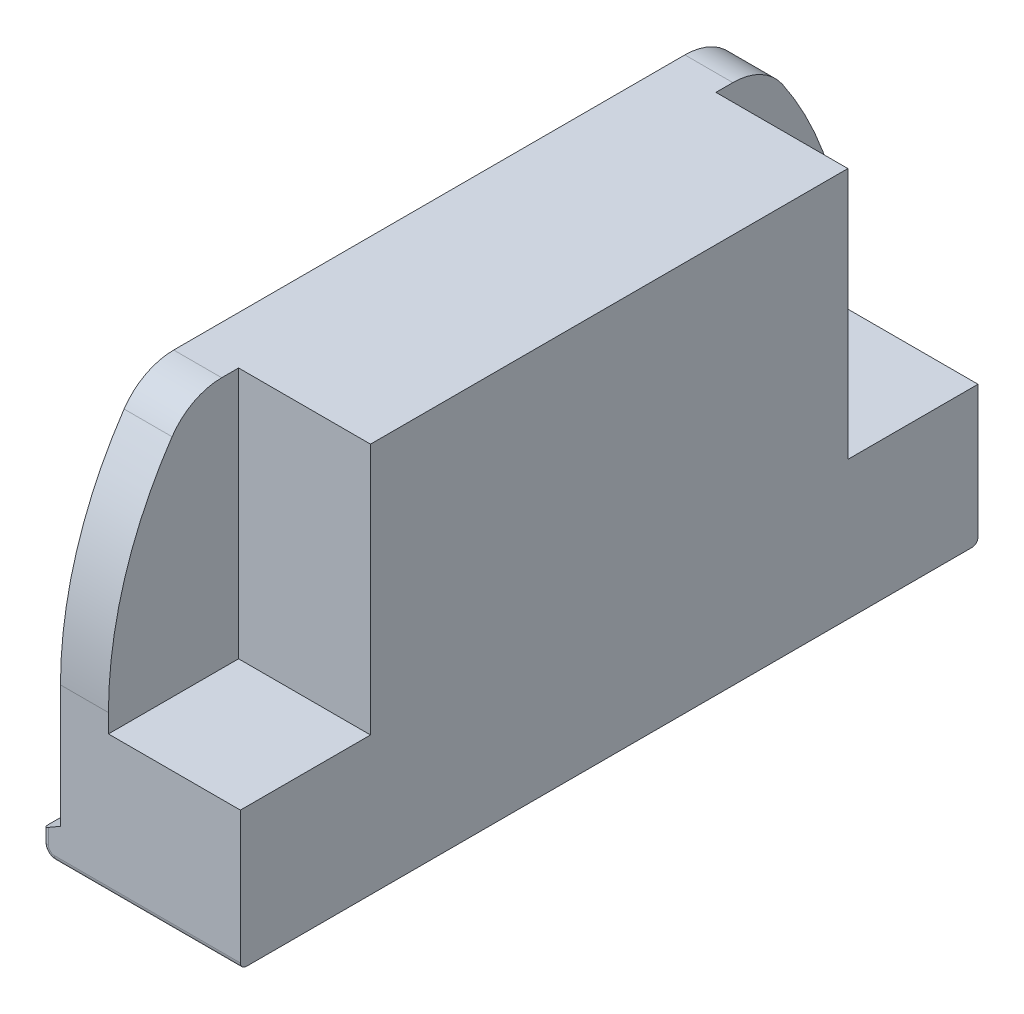
ISO-10303-21;
HEADER;
FILE_DESCRIPTION(('STEP AP214'),'2;1');
FILE_NAME('part.step','',(''),(''),'','','');
FILE_SCHEMA(('AUTOMOTIVE_DESIGN { 1 0 10303 214 1 1 1 1 }'));
ENDSEC;
DATA;
#1=APPLICATION_CONTEXT('core data for automotive mechanical design processes');
#2=APPLICATION_PROTOCOL_DEFINITION('international standard','automotive_design',2000,#1);
#3=PRODUCT_CONTEXT('',#1,'mechanical');
#4=PRODUCT('Part','Part','',(#3));
#5=PRODUCT_RELATED_PRODUCT_CATEGORY('part','',(#4));
#6=PRODUCT_DEFINITION_FORMATION('','',#4);
#7=PRODUCT_DEFINITION_CONTEXT('part definition',#1,'design');
#8=PRODUCT_DEFINITION('design','',#6,#7);
#9=PRODUCT_DEFINITION_SHAPE('','',#8);
#10=(LENGTH_UNIT() NAMED_UNIT(*) SI_UNIT(.MILLI.,.METRE.));
#11=(NAMED_UNIT(*) PLANE_ANGLE_UNIT() SI_UNIT($,.RADIAN.));
#12=(NAMED_UNIT(*) SI_UNIT($,.STERADIAN.) SOLID_ANGLE_UNIT());
#13=UNCERTAINTY_MEASURE_WITH_UNIT(LENGTH_MEASURE(1.E-05),#10,'distance_accuracy_value','');
#14=(GEOMETRIC_REPRESENTATION_CONTEXT(3) GLOBAL_UNCERTAINTY_ASSIGNED_CONTEXT((#13)) GLOBAL_UNIT_ASSIGNED_CONTEXT((#10,
#11,#12)) REPRESENTATION_CONTEXT('',''));
#15=CARTESIAN_POINT('',(0.,0.,0.));
#16=DIRECTION('',(0.,0.,1.));
#17=DIRECTION('',(1.,0.,0.));
#18=AXIS2_PLACEMENT_3D('',#15,#16,#17);
#19=CARTESIAN_POINT('',(0.299997713090983,1.78159871871872,12.3));
#20=DIRECTION('',(1.,0.,0.));
#21=DIRECTION('',(0.,0.,-1.));
#22=AXIS2_PLACEMENT_3D('',#19,#20,#21);
#23=PLANE('',#22);
#24=DIRECTION('',(0.,0.,-1.));
#25=VECTOR('',#24,1.);
#26=CARTESIAN_POINT('',(0.299997713090983,6.10745871871872,12.3));
#27=LINE('',#26,#25);
#28=CARTESIAN_POINT('',(0.299997713090983,6.10745872971482,10.4118765496414));
#29=VERTEX_POINT('',#28);
#30=CARTESIAN_POINT('',(0.299997713090983,6.10745872971482,1.88812345035856));
#31=VERTEX_POINT('',#30);
#32=EDGE_CURVE('E343',#29,#31,#27,.T.);
#33=ORIENTED_EDGE('',*,*,#32,.T.);
#34=CARTESIAN_POINT('',(0.299997713090983,5.10776748306749,1.88812345035856));
#35=DIRECTION('',(1.,0.,0.));
#36=DIRECTION('',(0.,0.,-1.));
#37=AXIS2_PLACEMENT_3D('',#34,#35,#36);
#38=CIRCLE('',#37,0.999691279635657);
#39=CARTESIAN_POINT('',(0.299997713090983,5.66904327195863,1.06086765957545));
#40=VERTEX_POINT('',#39);
#41=EDGE_CURVE('E245',#40,#31,#38,.T.);
#42=ORIENTED_EDGE('',*,*,#41,.F.);
#43=CARTESIAN_POINT('',(0.299997713090983,2.21592966698313,6.15035892658956));
#44=DIRECTION('',(1.,0.,0.));
#45=DIRECTION('',(0.,0.,-1.));
#46=AXIS2_PLACEMENT_3D('',#43,#44,#45);
#47=CIRCLE('',#46,6.15035892658956);
#48=CARTESIAN_POINT('',(0.299997713090983,2.21592966698313,0.));
#49=VERTEX_POINT('',#48);
#50=EDGE_CURVE('E252',#49,#40,#47,.T.);
#51=ORIENTED_EDGE('',*,*,#50,.F.);
#52=DIRECTION('',(0.,-1.,0.));
#53=VECTOR('',#52,1.);
#54=CARTESIAN_POINT('',(0.299997713090983,1.78159871871872,0.));
#55=LINE('',#54,#53);
#56=CARTESIAN_POINT('',(0.299997713090983,0.173208718718719,0.));
#57=VERTEX_POINT('',#56);
#58=EDGE_CURVE('E334',#49,#57,#55,.T.);
#59=ORIENTED_EDGE('',*,*,#58,.T.);
#60=DIRECTION('',(0.,0.,-1.));
#61=VECTOR('',#60,1.);
#62=CARTESIAN_POINT('',(0.299997713090983,0.173208718718719,12.3));
#63=LINE('',#62,#61);
#64=CARTESIAN_POINT('',(0.299997713090983,0.173208718718719,12.3));
#65=VERTEX_POINT('',#64);
#66=EDGE_CURVE('E340',#65,#57,#63,.T.);
#67=ORIENTED_EDGE('',*,*,#66,.F.);
#68=DIRECTION('',(0.,-1.,0.));
#69=VECTOR('',#68,1.);
#70=CARTESIAN_POINT('',(0.299997713090982,6.10745871871872,12.3));
#71=LINE('',#70,#69);
#72=CARTESIAN_POINT('',(0.299997713090983,2.21592966698313,12.3));
#73=VERTEX_POINT('',#72);
#74=EDGE_CURVE('E326',#73,#65,#71,.T.);
#75=ORIENTED_EDGE('',*,*,#74,.F.);
#76=CARTESIAN_POINT('',(0.299997713090983,2.21592966698313,6.14964107341044));
#77=DIRECTION('',(1.,0.,0.));
#78=DIRECTION('',(0.,0.,1.));
#79=AXIS2_PLACEMENT_3D('',#76,#77,#78);
#80=CIRCLE('',#79,6.15035892658956);
#81=CARTESIAN_POINT('',(0.299997713090983,5.66904327195863,11.2391323404246));
#82=VERTEX_POINT('',#81);
#83=EDGE_CURVE('E266',#82,#73,#80,.T.);
#84=ORIENTED_EDGE('',*,*,#83,.F.);
#85=CARTESIAN_POINT('',(0.299997713090983,5.10776748306749,10.4118765496414));
#86=DIRECTION('',(1.,0.,0.));
#87=DIRECTION('',(0.,0.,1.));
#88=AXIS2_PLACEMENT_3D('',#85,#86,#87);
#89=CIRCLE('',#88,0.999691279635658);
#90=EDGE_CURVE('E268',#29,#82,#89,.T.);
#91=ORIENTED_EDGE('',*,*,#90,.F.);
#92=EDGE_LOOP('',(#33,#42,#51,#59,#67,#75,#84,#91));
#93=FACE_BOUND('',#92,.T.);
#94=DIRECTION('',(0.,0.,1.));
#95=VECTOR('',#94,1.);
#96=CARTESIAN_POINT('',(0.299997713090983,4.37320871871872,3.00889598376581));
#97=LINE('',#96,#95);
#98=CARTESIAN_POINT('',(0.299997713090983,4.37320871871872,4.65));
#99=VERTEX_POINT('',#98);
#100=CARTESIAN_POINT('',(0.299997713090983,4.37320871871872,7.65));
#101=VERTEX_POINT('',#100);
#102=EDGE_CURVE('E220',#99,#101,#97,.T.);
#103=ORIENTED_EDGE('',*,*,#102,.T.);
#104=DIRECTION('',(0.,1.,0.));
#105=VECTOR('',#104,1.);
#106=CARTESIAN_POINT('',(0.299997713090983,2.78159871871872,7.65));
#107=LINE('',#106,#105);
#108=CARTESIAN_POINT('',(0.299997713090983,1.78159871871872,7.65));
#109=VERTEX_POINT('',#108);
#110=EDGE_CURVE('E203',#109,#101,#107,.T.);
#111=ORIENTED_EDGE('',*,*,#110,.F.);
#112=DIRECTION('',(0.,0.,1.));
#113=VECTOR('',#112,1.);
#114=CARTESIAN_POINT('',(0.299997713090983,1.78159871871872,4.65));
#115=LINE('',#114,#113);
#116=CARTESIAN_POINT('',(0.299997713090983,1.78159871871872,4.65));
#117=VERTEX_POINT('',#116);
#118=EDGE_CURVE('E215',#117,#109,#115,.T.);
#119=ORIENTED_EDGE('',*,*,#118,.F.);
#120=DIRECTION('',(0.,-1.,0.));
#121=VECTOR('',#120,1.);
#122=CARTESIAN_POINT('',(0.299997713090983,2.78159871871872,4.65));
#123=LINE('',#122,#121);
#124=EDGE_CURVE('E226',#99,#117,#123,.T.);
#125=ORIENTED_EDGE('',*,*,#124,.F.);
#126=EDGE_LOOP('',(#103,#111,#119,#125));
#127=FACE_BOUND('',#126,.T.);
#128=ADVANCED_FACE('F34',(#93,#127),#23,.F.);
#129=CARTESIAN_POINT('',(0.299997713090982,6.10745871871872,12.3));
#130=DIRECTION('',(0.,-1.,0.));
#131=DIRECTION('',(0.,0.,-1.));
#132=AXIS2_PLACEMENT_3D('',#129,#130,#131);
#133=PLANE('',#132);
#134=DIRECTION('',(1.,0.,0.));
#135=VECTOR('',#134,1.);
#136=CARTESIAN_POINT('',(3.29999771309098,6.10745871871872,2.17));
#137=LINE('',#136,#135);
#138=CARTESIAN_POINT('',(1.09999771309098,6.10745871871872,2.17));
#139=VERTEX_POINT('',#138);
#140=CARTESIAN_POINT('',(3.29999771309098,6.10745871871872,2.17));
#141=VERTEX_POINT('',#140);
#142=EDGE_CURVE('E303',#139,#141,#137,.T.);
#143=ORIENTED_EDGE('',*,*,#142,.F.);
#144=DIRECTION('',(0.,0.,1.));
#145=VECTOR('',#144,1.);
#146=CARTESIAN_POINT('',(1.09999771309098,6.10745871871872,0.));
#147=LINE('',#146,#145);
#148=CARTESIAN_POINT('',(1.09999771309098,6.10745872971482,1.88812345035856));
#149=VERTEX_POINT('',#148);
#150=EDGE_CURVE('E295',#149,#139,#147,.T.);
#151=ORIENTED_EDGE('',*,*,#150,.F.);
#152=DIRECTION('',(-1.,0.,0.));
#153=VECTOR('',#152,1.);
#154=CARTESIAN_POINT('',(5.42551835218583,6.10745874071093,1.88812345035856));
#155=LINE('',#154,#153);
#156=EDGE_CURVE('E248',#31,#149,#155,.F.);
#157=ORIENTED_EDGE('',*,*,#156,.F.);
#158=ORIENTED_EDGE('',*,*,#32,.F.);
#159=DIRECTION('',(-1.,0.,0.));
#160=VECTOR('',#159,1.);
#161=CARTESIAN_POINT('',(5.42551835218583,6.10745874071093,10.4118765496414));
#162=LINE('',#161,#160);
#163=CARTESIAN_POINT('',(1.09999771309098,6.10745872971482,10.4118765496414));
#164=VERTEX_POINT('',#163);
#165=EDGE_CURVE('E265',#29,#164,#162,.F.);
#166=ORIENTED_EDGE('',*,*,#165,.T.);
#167=DIRECTION('',(0.,0.,1.));
#168=VECTOR('',#167,1.);
#169=CARTESIAN_POINT('',(1.09999771309098,6.10745871871872,12.3));
#170=LINE('',#169,#168);
#171=CARTESIAN_POINT('',(1.09999771309098,6.10745871871872,10.13));
#172=VERTEX_POINT('',#171);
#173=EDGE_CURVE('E279',#172,#164,#170,.T.);
#174=ORIENTED_EDGE('',*,*,#173,.F.);
#175=DIRECTION('',(-1.,0.,0.));
#176=VECTOR('',#175,1.);
#177=CARTESIAN_POINT('',(3.29999771309098,6.10745871871872,10.13));
#178=LINE('',#177,#176);
#179=CARTESIAN_POINT('',(3.29999771309098,6.10745871871872,10.13));
#180=VERTEX_POINT('',#179);
#181=EDGE_CURVE('E288',#180,#172,#178,.T.);
#182=ORIENTED_EDGE('',*,*,#181,.F.);
#183=DIRECTION('',(0.,0.,-1.));
#184=VECTOR('',#183,1.);
#185=CARTESIAN_POINT('',(3.29999771309098,6.10745871871872,12.3));
#186=LINE('',#185,#184);
#187=EDGE_CURVE('E344',#180,#141,#186,.T.);
#188=ORIENTED_EDGE('',*,*,#187,.T.);
#189=EDGE_LOOP('',(#143,#151,#157,#158,#166,#174,#182,#188));
#190=FACE_BOUND('',#189,.T.);
#191=ADVANCED_FACE('F474',(#190),#133,.F.);
#192=CARTESIAN_POINT('',(0.2,-0.2,0.));
#193=DIRECTION('',(0.,0.,-1.));
#194=DIRECTION('',(-1.,0.,0.));
#195=AXIS2_PLACEMENT_3D('',#192,#193,#194);
#196=PLANE('',#195);
#197=CARTESIAN_POINT('',(0.2,-0.2,0.));
#198=DIRECTION('',(0.,0.,-1.));
#199=DIRECTION('',(-1.,0.,0.));
#200=AXIS2_PLACEMENT_3D('',#197,#198,#199);
#201=CIRCLE('',#200,0.1);
#202=CARTESIAN_POINT('',(0.200000000000001,-0.3,0.));
#203=VERTEX_POINT('',#202);
#204=CARTESIAN_POINT('',(0.1,-0.199999999999999,0.));
#205=VERTEX_POINT('',#204);
#206=EDGE_CURVE('E368',#203,#205,#201,.T.);
#207=ORIENTED_EDGE('',*,*,#206,.T.);
#208=DIRECTION('',(0.,-1.,0.));
#209=VECTOR('',#208,1.);
#210=CARTESIAN_POINT('',(0.1,0.,0.));
#211=LINE('',#210,#209);
#212=CARTESIAN_POINT('',(0.1,0.0577366797013509,0.));
#213=VERTEX_POINT('',#212);
#214=EDGE_CURVE('E370',#205,#213,#211,.F.);
#215=ORIENTED_EDGE('',*,*,#214,.T.);
#216=DIRECTION('',(-0.866019205828305,-0.500010735021271,0.));
#217=VECTOR('',#216,1.);
#218=CARTESIAN_POINT('',(0.,0.,0.));
#219=LINE('',#218,#217);
#220=EDGE_CURVE('E327',#57,#213,#219,.T.);
#221=ORIENTED_EDGE('',*,*,#220,.F.);
#222=ORIENTED_EDGE('',*,*,#58,.F.);
#223=DIRECTION('',(-1.,0.,0.));
#224=VECTOR('',#223,1.);
#225=CARTESIAN_POINT('',(5.42551835218583,2.21592966698313,0.));
#226=LINE('',#225,#224);
#227=CARTESIAN_POINT('',(1.09999771309098,2.21592966698313,0.));
#228=VERTEX_POINT('',#227);
#229=EDGE_CURVE('E255',#228,#49,#226,.T.);
#230=ORIENTED_EDGE('',*,*,#229,.F.);
#231=DIRECTION('',(0.,1.,0.));
#232=VECTOR('',#231,1.);
#233=CARTESIAN_POINT('',(1.09999771309098,1.90745871871872,0.));
#234=LINE('',#233,#232);
#235=CARTESIAN_POINT('',(1.09999771309098,1.90745871871872,0.));
#236=VERTEX_POINT('',#235);
#237=EDGE_CURVE('E312',#236,#228,#234,.T.);
#238=ORIENTED_EDGE('',*,*,#237,.F.);
#239=DIRECTION('',(-1.,0.,0.));
#240=VECTOR('',#239,1.);
#241=CARTESIAN_POINT('',(3.29999771309098,1.90745871871872,0.));
#242=LINE('',#241,#240);
#243=CARTESIAN_POINT('',(3.29999771309098,1.90745871871872,0.));
#244=VERTEX_POINT('',#243);
#245=EDGE_CURVE('E302',#244,#236,#242,.T.);
#246=ORIENTED_EDGE('',*,*,#245,.F.);
#247=DIRECTION('',(0.,1.,0.));
#248=VECTOR('',#247,1.);
#249=CARTESIAN_POINT('',(3.29999771309098,6.10745871871872,0.));
#250=LINE('',#249,#248);
#251=CARTESIAN_POINT('',(3.29999771309098,-0.299999999999999,0.));
#252=VERTEX_POINT('',#251);
#253=EDGE_CURVE('E318',#252,#244,#250,.T.);
#254=ORIENTED_EDGE('',*,*,#253,.F.);
#255=DIRECTION('',(1.,0.,0.));
#256=VECTOR('',#255,1.);
#257=CARTESIAN_POINT('',(0.200000000000001,-0.3,0.));
#258=LINE('',#257,#256);
#259=EDGE_CURVE('E366',#252,#203,#258,.F.);
#260=ORIENTED_EDGE('',*,*,#259,.T.);
#261=EDGE_LOOP('',(#207,#215,#221,#222,#230,#238,#246,#254,#260));
#262=FACE_BOUND('',#261,.T.);
#263=ADVANCED_FACE('F463',(#262),#196,.T.);
#264=CARTESIAN_POINT('',(0.2,-0.2,12.3));
#265=DIRECTION('',(0.,0.,-1.));
#266=DIRECTION('',(-1.,0.,0.));
#267=AXIS2_PLACEMENT_3D('',#264,#265,#266);
#268=PLANE('',#267);
#269=DIRECTION('',(-0.866019205828305,-0.500010735021271,0.));
#270=VECTOR('',#269,1.);
#271=CARTESIAN_POINT('',(0.,0.,12.3));
#272=LINE('',#271,#270);
#273=CARTESIAN_POINT('',(0.1,0.0577366797013509,12.3));
#274=VERTEX_POINT('',#273);
#275=EDGE_CURVE('E329',#65,#274,#272,.T.);
#276=ORIENTED_EDGE('',*,*,#275,.T.);
#277=DIRECTION('',(0.,-1.,0.));
#278=VECTOR('',#277,1.);
#279=CARTESIAN_POINT('',(0.1,-0.2,12.3));
#280=LINE('',#279,#278);
#281=CARTESIAN_POINT('',(0.1,-0.199999999999999,12.3));
#282=VERTEX_POINT('',#281);
#283=EDGE_CURVE('E384',#274,#282,#280,.T.);
#284=ORIENTED_EDGE('',*,*,#283,.T.);
#285=CARTESIAN_POINT('',(0.2,-0.2,12.3));
#286=DIRECTION('',(0.,0.,-1.));
#287=DIRECTION('',(-1.,0.,0.));
#288=AXIS2_PLACEMENT_3D('',#285,#286,#287);
#289=CIRCLE('',#288,0.1);
#290=CARTESIAN_POINT('',(0.200000000000001,-0.3,12.3));
#291=VERTEX_POINT('',#290);
#292=EDGE_CURVE('E382',#282,#291,#289,.F.);
#293=ORIENTED_EDGE('',*,*,#292,.T.);
#294=DIRECTION('',(1.,0.,0.));
#295=VECTOR('',#294,1.);
#296=CARTESIAN_POINT('',(0.2,-0.3,12.3));
#297=LINE('',#296,#295);
#298=CARTESIAN_POINT('',(3.29999771309098,-0.299999999999999,12.3));
#299=VERTEX_POINT('',#298);
#300=EDGE_CURVE('E380',#291,#299,#297,.T.);
#301=ORIENTED_EDGE('',*,*,#300,.T.);
#302=DIRECTION('',(0.,1.,0.));
#303=VECTOR('',#302,1.);
#304=CARTESIAN_POINT('',(3.29999771309098,0.646828718718718,12.3));
#305=LINE('',#304,#303);
#306=CARTESIAN_POINT('',(3.29999771309098,1.90745871871872,12.3));
#307=VERTEX_POINT('',#306);
#308=EDGE_CURVE('E324',#299,#307,#305,.T.);
#309=ORIENTED_EDGE('',*,*,#308,.T.);
#310=DIRECTION('',(1.,0.,0.));
#311=VECTOR('',#310,1.);
#312=CARTESIAN_POINT('',(3.29999771309098,1.90745871871872,12.3));
#313=LINE('',#312,#311);
#314=CARTESIAN_POINT('',(1.09999771309098,1.90745871871872,12.3));
#315=VERTEX_POINT('',#314);
#316=EDGE_CURVE('E284',#315,#307,#313,.T.);
#317=ORIENTED_EDGE('',*,*,#316,.F.);
#318=DIRECTION('',(0.,1.,0.));
#319=VECTOR('',#318,1.);
#320=CARTESIAN_POINT('',(1.09999771309098,1.90745871871872,12.3));
#321=LINE('',#320,#319);
#322=CARTESIAN_POINT('',(1.09999771309098,2.21592966698313,12.3));
#323=VERTEX_POINT('',#322);
#324=EDGE_CURVE('E292',#315,#323,#321,.T.);
#325=ORIENTED_EDGE('',*,*,#324,.T.);
#326=DIRECTION('',(-1.,0.,0.));
#327=VECTOR('',#326,1.);
#328=CARTESIAN_POINT('',(5.42551835218583,2.21592966698313,12.3));
#329=LINE('',#328,#327);
#330=EDGE_CURVE('E270',#323,#73,#329,.T.);
#331=ORIENTED_EDGE('',*,*,#330,.T.);
#332=ORIENTED_EDGE('',*,*,#74,.T.);
#333=EDGE_LOOP('',(#276,#284,#293,#301,#309,#317,#325,#331,#332));
#334=FACE_BOUND('',#333,.T.);
#335=ADVANCED_FACE('F409',(#334),#268,.F.);
#336=CARTESIAN_POINT('',(0.,0.,12.3));
#337=DIRECTION('',(1.,0.,0.));
#338=DIRECTION('',(0.,1.,0.));
#339=AXIS2_PLACEMENT_3D('',#336,#337,#338);
#340=PLANE('',#339);
#341=DIRECTION('',(0.,0.,-1.));
#342=VECTOR('',#341,1.);
#343=CARTESIAN_POINT('',(0.,0.,12.3));
#344=LINE('',#343,#342);
#345=CARTESIAN_POINT('',(0.,0.,12.2));
#346=VERTEX_POINT('',#345);
#347=CARTESIAN_POINT('',(0.,0.,0.0999999999999994));
#348=VERTEX_POINT('',#347);
#349=EDGE_CURVE('E332',#346,#348,#344,.T.);
#350=ORIENTED_EDGE('',*,*,#349,.T.);
#351=DIRECTION('',(0.,-1.,0.));
#352=VECTOR('',#351,1.);
#353=CARTESIAN_POINT('',(0.,-0.199999999999999,0.0999999999999994));
#354=LINE('',#353,#352);
#355=CARTESIAN_POINT('',(0.,-0.199999999999999,0.0999999999999994));
#356=VERTEX_POINT('',#355);
#357=EDGE_CURVE('E363',#348,#356,#354,.T.);
#358=ORIENTED_EDGE('',*,*,#357,.T.);
#359=DIRECTION('',(0.,0.,-1.));
#360=VECTOR('',#359,1.);
#361=CARTESIAN_POINT('',(0.,-0.199999999999999,12.3));
#362=LINE('',#361,#360);
#363=CARTESIAN_POINT('',(0.,-0.199999999999999,12.2));
#364=VERTEX_POINT('',#363);
#365=EDGE_CURVE('E350',#364,#356,#362,.T.);
#366=ORIENTED_EDGE('',*,*,#365,.F.);
#367=DIRECTION('',(0.,-1.,0.));
#368=VECTOR('',#367,1.);
#369=CARTESIAN_POINT('',(0.,0.,12.2));
#370=LINE('',#369,#368);
#371=EDGE_CURVE('E360',#364,#346,#370,.F.);
#372=ORIENTED_EDGE('',*,*,#371,.T.);
#373=EDGE_LOOP('',(#350,#358,#366,#372));
#374=FACE_BOUND('',#373,.T.);
#375=ADVANCED_FACE('F440',(#374),#340,.F.);
#376=CARTESIAN_POINT('',(0.2,-0.2,12.3));
#377=DIRECTION('',(0.,0.,-1.));
#378=DIRECTION('',(-1.,0.,0.));
#379=AXIS2_PLACEMENT_3D('',#376,#377,#378);
#380=CYLINDRICAL_SURFACE('',#379,0.2);
#381=ORIENTED_EDGE('',*,*,#365,.T.);
#382=CARTESIAN_POINT('',(0.2,-0.2,0.0999999999999994));
#383=DIRECTION('',(0.,0.,-1.));
#384=DIRECTION('',(-1.,0.,0.));
#385=AXIS2_PLACEMENT_3D('',#382,#383,#384);
#386=CIRCLE('',#385,0.2);
#387=CARTESIAN_POINT('',(0.200000000000001,-0.4,0.0999999999999994));
#388=VERTEX_POINT('',#387);
#389=EDGE_CURVE('E378',#356,#388,#386,.F.);
#390=ORIENTED_EDGE('',*,*,#389,.T.);
#391=DIRECTION('',(0.,0.,-1.));
#392=VECTOR('',#391,1.);
#393=CARTESIAN_POINT('',(0.200000000000001,-0.4,12.3));
#394=LINE('',#393,#392);
#395=CARTESIAN_POINT('',(0.200000000000001,-0.4,12.2));
#396=VERTEX_POINT('',#395);
#397=EDGE_CURVE('E348',#396,#388,#394,.T.);
#398=ORIENTED_EDGE('',*,*,#397,.F.);
#399=CARTESIAN_POINT('',(0.2,-0.2,12.2));
#400=DIRECTION('',(0.,0.,-1.));
#401=DIRECTION('',(-1.,0.,0.));
#402=AXIS2_PLACEMENT_3D('',#399,#400,#401);
#403=CIRCLE('',#402,0.2);
#404=EDGE_CURVE('E376',#396,#364,#403,.T.);
#405=ORIENTED_EDGE('',*,*,#404,.T.);
#406=EDGE_LOOP('',(#381,#390,#398,#405));
#407=FACE_BOUND('',#406,.T.);
#408=ADVANCED_FACE('F453',(#407),#380,.T.);
#409=CARTESIAN_POINT('',(3.29999771309098,-0.399999999999999,12.3));
#410=DIRECTION('',(0.,1.,0.));
#411=DIRECTION('',(-1.,0.,0.));
#412=AXIS2_PLACEMENT_3D('',#409,#410,#411);
#413=PLANE('',#412);
#414=ORIENTED_EDGE('',*,*,#397,.T.);
#415=DIRECTION('',(1.,0.,0.));
#416=VECTOR('',#415,1.);
#417=CARTESIAN_POINT('',(3.29999771309098,-0.399999999999999,0.0999999999999994));
#418=LINE('',#417,#416);
#419=CARTESIAN_POINT('',(3.29999771309098,-0.399999999999999,0.0999999999999994));
#420=VERTEX_POINT('',#419);
#421=EDGE_CURVE('E51',#388,#420,#418,.T.);
#422=ORIENTED_EDGE('',*,*,#421,.T.);
#423=DIRECTION('',(0.,0.,-1.));
#424=VECTOR('',#423,1.);
#425=CARTESIAN_POINT('',(3.29999771309098,-0.399999999999999,12.3));
#426=LINE('',#425,#424);
#427=CARTESIAN_POINT('',(3.29999771309098,-0.399999999999999,12.2));
#428=VERTEX_POINT('',#427);
#429=EDGE_CURVE('E346',#428,#420,#426,.T.);
#430=ORIENTED_EDGE('',*,*,#429,.F.);
#431=DIRECTION('',(1.,0.,0.));
#432=VECTOR('',#431,1.);
#433=CARTESIAN_POINT('',(3.29999771309098,-0.399999999999999,12.2));
#434=LINE('',#433,#432);
#435=EDGE_CURVE('E387',#428,#396,#434,.F.);
#436=ORIENTED_EDGE('',*,*,#435,.T.);
#437=EDGE_LOOP('',(#414,#422,#430,#436));
#438=FACE_BOUND('',#437,.T.);
#439=ADVANCED_FACE('F454',(#438),#413,.F.);
#440=CARTESIAN_POINT('',(3.29999771309098,6.10745871871872,12.3));
#441=DIRECTION('',(-1.,0.,0.));
#442=DIRECTION('',(0.,-1.,0.));
#443=AXIS2_PLACEMENT_3D('',#440,#441,#442);
#444=PLANE('',#443);
#445=ORIENTED_EDGE('',*,*,#429,.T.);
#446=CARTESIAN_POINT('',(3.29999771309098,-0.299999999999999,0.0999999999999994));
#447=DIRECTION('',(-1.,0.,0.));
#448=DIRECTION('',(0.,-1.,0.));
#449=AXIS2_PLACEMENT_3D('',#446,#447,#448);
#450=CIRCLE('',#449,0.1);
#451=EDGE_CURVE('E11',#420,#252,#450,.F.);
#452=ORIENTED_EDGE('',*,*,#451,.T.);
#453=ORIENTED_EDGE('',*,*,#253,.T.);
#454=DIRECTION('',(0.,0.,-1.));
#455=VECTOR('',#454,1.);
#456=CARTESIAN_POINT('',(3.29999771309098,1.90745871871872,0.));
#457=LINE('',#456,#455);
#458=CARTESIAN_POINT('',(3.29999771309098,1.90745871871872,2.17));
#459=VERTEX_POINT('',#458);
#460=EDGE_CURVE('E299',#459,#244,#457,.T.);
#461=ORIENTED_EDGE('',*,*,#460,.F.);
#462=DIRECTION('',(0.,1.,0.));
#463=VECTOR('',#462,1.);
#464=CARTESIAN_POINT('',(3.29999771309098,1.90745871871872,2.17));
#465=LINE('',#464,#463);
#466=EDGE_CURVE('E315',#459,#141,#465,.T.);
#467=ORIENTED_EDGE('',*,*,#466,.T.);
#468=ORIENTED_EDGE('',*,*,#187,.F.);
#469=DIRECTION('',(0.,1.,0.));
#470=VECTOR('',#469,1.);
#471=CARTESIAN_POINT('',(3.29999771309098,1.90745871871872,10.13));
#472=LINE('',#471,#470);
#473=CARTESIAN_POINT('',(3.29999771309098,1.90745871871872,10.13));
#474=VERTEX_POINT('',#473);
#475=EDGE_CURVE('E287',#474,#180,#472,.T.);
#476=ORIENTED_EDGE('',*,*,#475,.F.);
#477=DIRECTION('',(0.,0.,-1.));
#478=VECTOR('',#477,1.);
#479=CARTESIAN_POINT('',(3.29999771309098,1.90745871871872,12.3));
#480=LINE('',#479,#478);
#481=EDGE_CURVE('E275',#307,#474,#480,.T.);
#482=ORIENTED_EDGE('',*,*,#481,.F.);
#483=ORIENTED_EDGE('',*,*,#308,.F.);
#484=CARTESIAN_POINT('',(3.29999771309098,-0.299999999999999,12.2));
#485=DIRECTION('',(-1.,0.,0.));
#486=DIRECTION('',(0.,-1.,0.));
#487=AXIS2_PLACEMENT_3D('',#484,#485,#486);
#488=CIRCLE('',#487,0.1);
#489=EDGE_CURVE('E43',#299,#428,#488,.F.);
#490=ORIENTED_EDGE('',*,*,#489,.T.);
#491=EDGE_LOOP('',(#445,#452,#453,#461,#467,#468,#476,#482,#483,#490));
#492=FACE_BOUND('',#491,.T.);
#493=ADVANCED_FACE('F412',(#492),#444,.F.);
#494=CARTESIAN_POINT('',(0.,0.,12.3));
#495=DIRECTION('',(0.500010735021271,-0.866019205828305,0.));
#496=DIRECTION('',(0.866019205828305,0.500010735021271,0.));
#497=AXIS2_PLACEMENT_3D('',#494,#495,#496);
#498=PLANE('',#497);
#499=ORIENTED_EDGE('',*,*,#220,.T.);
#500=CARTESIAN_POINT('',(0.1,0.0577366797013509,0.0999999999999994));
#501=DIRECTION('',(0.500010735021271,-0.866019205828305,0.));
#502=DIRECTION('',(0.866019205828305,0.500010735021271,0.));
#503=AXIS2_PLACEMENT_3D('',#500,#501,#502);
#504=ELLIPSE('',#503,0.115470880237991,0.1);
#505=EDGE_CURVE('E374',#213,#348,#504,.F.);
#506=ORIENTED_EDGE('',*,*,#505,.T.);
#507=ORIENTED_EDGE('',*,*,#349,.F.);
#508=CARTESIAN_POINT('',(0.1,0.0577366797013509,12.2));
#509=DIRECTION('',(0.500010735021271,-0.866019205828305,0.));
#510=DIRECTION('',(-0.866019205828305,-0.500010735021271,0.));
#511=AXIS2_PLACEMENT_3D('',#508,#509,#510);
#512=ELLIPSE('',#511,0.115470880237991,0.1);
#513=EDGE_CURVE('E372',#346,#274,#512,.F.);
#514=ORIENTED_EDGE('',*,*,#513,.T.);
#515=ORIENTED_EDGE('',*,*,#275,.F.);
#516=ORIENTED_EDGE('',*,*,#66,.T.);
#517=EDGE_LOOP('',(#499,#506,#507,#514,#515,#516));
#518=FACE_BOUND('',#517,.T.);
#519=ADVANCED_FACE('F436',(#518),#498,.F.);
#520=CARTESIAN_POINT('',(3.29999771309098,1.90745871871872,2.17));
#521=DIRECTION('',(0.,0.,1.));
#522=DIRECTION('',(1.,0.,0.));
#523=AXIS2_PLACEMENT_3D('',#520,#521,#522);
#524=PLANE('',#523);
#525=ORIENTED_EDGE('',*,*,#142,.T.);
#526=ORIENTED_EDGE('',*,*,#466,.F.);
#527=DIRECTION('',(1.,0.,0.));
#528=VECTOR('',#527,1.);
#529=CARTESIAN_POINT('',(3.29999771309098,1.90745871871872,2.17));
#530=LINE('',#529,#528);
#531=CARTESIAN_POINT('',(1.09999771309098,1.90745871871872,2.17));
#532=VERTEX_POINT('',#531);
#533=EDGE_CURVE('E309',#532,#459,#530,.T.);
#534=ORIENTED_EDGE('',*,*,#533,.F.);
#535=DIRECTION('',(0.,1.,0.));
#536=VECTOR('',#535,1.);
#537=CARTESIAN_POINT('',(1.09999771309098,1.90745871871872,2.17));
#538=LINE('',#537,#536);
#539=EDGE_CURVE('E319',#532,#139,#538,.T.);
#540=ORIENTED_EDGE('',*,*,#539,.T.);
#541=EDGE_LOOP('',(#525,#526,#534,#540));
#542=FACE_BOUND('',#541,.T.);
#543=ADVANCED_FACE('F470',(#542),#524,.F.);
#544=CARTESIAN_POINT('',(1.09999771309098,1.90745871871872,0.));
#545=DIRECTION('',(-1.,0.,0.));
#546=DIRECTION('',(0.,0.,1.));
#547=AXIS2_PLACEMENT_3D('',#544,#545,#546);
#548=PLANE('',#547);
#549=CARTESIAN_POINT('',(1.09999771309098,2.21592966698313,6.15035892658956));
#550=DIRECTION('',(-1.,0.,0.));
#551=DIRECTION('',(0.,0.,1.));
#552=AXIS2_PLACEMENT_3D('',#549,#550,#551);
#553=CIRCLE('',#552,6.15035892658956);
#554=CARTESIAN_POINT('',(1.09999771309098,5.66904327195863,1.06086765957545));
#555=VERTEX_POINT('',#554);
#556=EDGE_CURVE('E246',#555,#228,#553,.T.);
#557=ORIENTED_EDGE('',*,*,#556,.F.);
#558=CARTESIAN_POINT('',(1.09999771309098,5.10776748306749,1.88812345035856));
#559=DIRECTION('',(-1.,0.,0.));
#560=DIRECTION('',(0.,0.,1.));
#561=AXIS2_PLACEMENT_3D('',#558,#559,#560);
#562=CIRCLE('',#561,0.999691279635657);
#563=EDGE_CURVE('E353',#555,#149,#562,.F.);
#564=ORIENTED_EDGE('',*,*,#563,.T.);
#565=ORIENTED_EDGE('',*,*,#150,.T.);
#566=ORIENTED_EDGE('',*,*,#539,.F.);
#567=DIRECTION('',(0.,0.,1.));
#568=VECTOR('',#567,1.);
#569=CARTESIAN_POINT('',(1.09999771309098,1.90745871871872,0.));
#570=LINE('',#569,#568);
#571=EDGE_CURVE('E306',#236,#532,#570,.T.);
#572=ORIENTED_EDGE('',*,*,#571,.F.);
#573=ORIENTED_EDGE('',*,*,#237,.T.);
#574=EDGE_LOOP('',(#557,#564,#565,#566,#572,#573));
#575=FACE_BOUND('',#574,.T.);
#576=ADVANCED_FACE('F493',(#575),#548,.F.);
#577=CARTESIAN_POINT('',(0.,1.90745871871872,0.));
#578=DIRECTION('',(0.,-1.,0.));
#579=DIRECTION('',(0.,0.,-1.));
#580=AXIS2_PLACEMENT_3D('',#577,#578,#579);
#581=PLANE('',#580);
#582=ORIENTED_EDGE('',*,*,#460,.T.);
#583=ORIENTED_EDGE('',*,*,#245,.T.);
#584=ORIENTED_EDGE('',*,*,#571,.T.);
#585=ORIENTED_EDGE('',*,*,#533,.T.);
#586=EDGE_LOOP('',(#582,#583,#584,#585));
#587=FACE_BOUND('',#586,.T.);
#588=ADVANCED_FACE('F467',(#587),#581,.F.);
#589=CARTESIAN_POINT('',(1.09999771309098,1.90745871871872,12.3));
#590=DIRECTION('',(-1.,0.,0.));
#591=DIRECTION('',(0.,0.,1.));
#592=AXIS2_PLACEMENT_3D('',#589,#590,#591);
#593=PLANE('',#592);
#594=CARTESIAN_POINT('',(1.09999771309098,5.10776748306749,10.4118765496414));
#595=DIRECTION('',(-1.,0.,0.));
#596=DIRECTION('',(0.,0.,1.));
#597=AXIS2_PLACEMENT_3D('',#594,#595,#596);
#598=CIRCLE('',#597,0.999691279635658);
#599=CARTESIAN_POINT('',(1.09999771309098,5.66904327195863,11.2391323404246));
#600=VERTEX_POINT('',#599);
#601=EDGE_CURVE('E258',#600,#164,#598,.T.);
#602=ORIENTED_EDGE('',*,*,#601,.F.);
#603=CARTESIAN_POINT('',(1.09999771309098,2.21592966698313,6.14964107341044));
#604=DIRECTION('',(-1.,0.,0.));
#605=DIRECTION('',(0.,0.,1.));
#606=AXIS2_PLACEMENT_3D('',#603,#604,#605);
#607=CIRCLE('',#606,6.15035892658956);
#608=EDGE_CURVE('E261',#323,#600,#607,.T.);
#609=ORIENTED_EDGE('',*,*,#608,.F.);
#610=ORIENTED_EDGE('',*,*,#324,.F.);
#611=DIRECTION('',(0.,0.,1.));
#612=VECTOR('',#611,1.);
#613=CARTESIAN_POINT('',(1.09999771309098,1.90745871871872,12.3));
#614=LINE('',#613,#612);
#615=CARTESIAN_POINT('',(1.09999771309098,1.90745871871872,10.13));
#616=VERTEX_POINT('',#615);
#617=EDGE_CURVE('E282',#616,#315,#614,.T.);
#618=ORIENTED_EDGE('',*,*,#617,.F.);
#619=DIRECTION('',(0.,1.,0.));
#620=VECTOR('',#619,1.);
#621=CARTESIAN_POINT('',(1.09999771309098,1.90745871871872,10.13));
#622=LINE('',#621,#620);
#623=EDGE_CURVE('E296',#616,#172,#622,.T.);
#624=ORIENTED_EDGE('',*,*,#623,.T.);
#625=ORIENTED_EDGE('',*,*,#173,.T.);
#626=EDGE_LOOP('',(#602,#609,#610,#618,#624,#625));
#627=FACE_BOUND('',#626,.T.);
#628=ADVANCED_FACE('F423',(#627),#593,.F.);
#629=CARTESIAN_POINT('',(3.29999771309098,1.90745871871872,10.13));
#630=DIRECTION('',(0.,0.,-1.));
#631=DIRECTION('',(-1.,0.,0.));
#632=AXIS2_PLACEMENT_3D('',#629,#630,#631);
#633=PLANE('',#632);
#634=ORIENTED_EDGE('',*,*,#181,.T.);
#635=ORIENTED_EDGE('',*,*,#623,.F.);
#636=DIRECTION('',(-1.,0.,0.));
#637=VECTOR('',#636,1.);
#638=CARTESIAN_POINT('',(3.29999771309098,1.90745871871872,10.13));
#639=LINE('',#638,#637);
#640=EDGE_CURVE('E278',#474,#616,#639,.T.);
#641=ORIENTED_EDGE('',*,*,#640,.F.);
#642=ORIENTED_EDGE('',*,*,#475,.T.);
#643=EDGE_LOOP('',(#634,#635,#641,#642));
#644=FACE_BOUND('',#643,.T.);
#645=ADVANCED_FACE('F479',(#644),#633,.F.);
#646=CARTESIAN_POINT('',(0.,1.90745871871872,0.));
#647=DIRECTION('',(0.,1.,0.));
#648=DIRECTION('',(0.,0.,1.));
#649=AXIS2_PLACEMENT_3D('',#646,#647,#648);
#650=PLANE('',#649);
#651=ORIENTED_EDGE('',*,*,#481,.T.);
#652=ORIENTED_EDGE('',*,*,#640,.T.);
#653=ORIENTED_EDGE('',*,*,#617,.T.);
#654=ORIENTED_EDGE('',*,*,#316,.T.);
#655=EDGE_LOOP('',(#651,#652,#653,#654));
#656=FACE_BOUND('',#655,.T.);
#657=ADVANCED_FACE('F416',(#656),#650,.T.);
#658=CARTESIAN_POINT('',(5.42551835218583,5.10776748306749,10.4118765496414));
#659=DIRECTION('',(-1.,0.,0.));
#660=DIRECTION('',(0.,0.,1.));
#661=AXIS2_PLACEMENT_3D('',#658,#659,#660);
#662=CYLINDRICAL_SURFACE('',#661,0.999691279635658);
#663=ORIENTED_EDGE('',*,*,#90,.T.);
#664=DIRECTION('',(-1.,0.,0.));
#665=VECTOR('',#664,1.);
#666=CARTESIAN_POINT('',(5.42551835218583,5.66904327195863,11.2391323404246));
#667=LINE('',#666,#665);
#668=EDGE_CURVE('E262',#600,#82,#667,.T.);
#669=ORIENTED_EDGE('',*,*,#668,.F.);
#670=ORIENTED_EDGE('',*,*,#601,.T.);
#671=ORIENTED_EDGE('',*,*,#165,.F.);
#672=EDGE_LOOP('',(#663,#669,#670,#671));
#673=FACE_BOUND('',#672,.T.);
#674=ADVANCED_FACE('F481',(#673),#662,.T.);
#675=CARTESIAN_POINT('',(5.42551835218583,2.21592966698313,6.14964107341044));
#676=DIRECTION('',(-1.,0.,0.));
#677=DIRECTION('',(0.,0.,1.));
#678=AXIS2_PLACEMENT_3D('',#675,#676,#677);
#679=CYLINDRICAL_SURFACE('',#678,6.15035892658956);
#680=ORIENTED_EDGE('',*,*,#608,.T.);
#681=ORIENTED_EDGE('',*,*,#668,.T.);
#682=ORIENTED_EDGE('',*,*,#83,.T.);
#683=ORIENTED_EDGE('',*,*,#330,.F.);
#684=EDGE_LOOP('',(#680,#681,#682,#683));
#685=FACE_BOUND('',#684,.T.);
#686=ADVANCED_FACE('F425',(#685),#679,.T.);
#687=CARTESIAN_POINT('',(5.42551835218583,5.10776748306749,1.88812345035856));
#688=DIRECTION('',(-1.,0.,0.));
#689=DIRECTION('',(0.,0.,1.));
#690=AXIS2_PLACEMENT_3D('',#687,#688,#689);
#691=CYLINDRICAL_SURFACE('',#690,0.999691279635657);
#692=ORIENTED_EDGE('',*,*,#156,.T.);
#693=ORIENTED_EDGE('',*,*,#563,.F.);
#694=DIRECTION('',(-1.,0.,0.));
#695=VECTOR('',#694,1.);
#696=CARTESIAN_POINT('',(5.42551835218583,5.66904327195863,1.06086765957545));
#697=LINE('',#696,#695);
#698=EDGE_CURVE('E249',#555,#40,#697,.T.);
#699=ORIENTED_EDGE('',*,*,#698,.T.);
#700=ORIENTED_EDGE('',*,*,#41,.T.);
#701=EDGE_LOOP('',(#692,#693,#699,#700));
#702=FACE_BOUND('',#701,.T.);
#703=ADVANCED_FACE('F485',(#702),#691,.T.);
#704=CARTESIAN_POINT('',(5.42551835218583,2.21592966698313,6.15035892658956));
#705=DIRECTION('',(-1.,0.,0.));
#706=DIRECTION('',(0.,0.,1.));
#707=AXIS2_PLACEMENT_3D('',#704,#705,#706);
#708=CYLINDRICAL_SURFACE('',#707,6.15035892658956);
#709=ORIENTED_EDGE('',*,*,#556,.T.);
#710=ORIENTED_EDGE('',*,*,#229,.T.);
#711=ORIENTED_EDGE('',*,*,#50,.T.);
#712=ORIENTED_EDGE('',*,*,#698,.F.);
#713=EDGE_LOOP('',(#709,#710,#711,#712));
#714=FACE_BOUND('',#713,.T.);
#715=ADVANCED_FACE('F489',(#714),#708,.T.);
#716=CARTESIAN_POINT('',(-0.100002286909017,2.78159871871872,4.65));
#717=DIRECTION('',(0.,0.,1.));
#718=DIRECTION('',(1.,0.,0.));
#719=AXIS2_PLACEMENT_3D('',#716,#717,#718);
#720=PLANE('',#719);
#721=ORIENTED_EDGE('',*,*,#124,.T.);
#722=DIRECTION('',(1.,0.,0.));
#723=VECTOR('',#722,1.);
#724=CARTESIAN_POINT('',(-0.100002286909017,1.78159871871872,4.65));
#725=LINE('',#724,#723);
#726=CARTESIAN_POINT('',(-0.100002286909017,1.78159871871872,4.65));
#727=VERTEX_POINT('',#726);
#728=EDGE_CURVE('E242',#727,#117,#725,.T.);
#729=ORIENTED_EDGE('',*,*,#728,.F.);
#730=DIRECTION('',(0.,-1.,0.));
#731=VECTOR('',#730,1.);
#732=CARTESIAN_POINT('',(-0.100002286909017,2.78159871871872,4.65));
#733=LINE('',#732,#731);
#734=CARTESIAN_POINT('',(-0.100002286909017,2.78159871871872,4.65));
#735=VERTEX_POINT('',#734);
#736=EDGE_CURVE('E214',#735,#727,#733,.T.);
#737=ORIENTED_EDGE('',*,*,#736,.F.);
#738=DIRECTION('',(0.24373835908212,0.969841024246735,0.));
#739=VECTOR('',#738,1.);
#740=CARTESIAN_POINT('',(0.299997713090983,4.37320871871872,4.65));
#741=LINE('',#740,#739);
#742=EDGE_CURVE('E228',#735,#99,#741,.T.);
#743=ORIENTED_EDGE('',*,*,#742,.T.);
#744=EDGE_LOOP('',(#721,#729,#737,#743));
#745=FACE_BOUND('',#744,.T.);
#746=ADVANCED_FACE('F575',(#745),#720,.F.);
#747=CARTESIAN_POINT('',(-0.100002286909017,1.78159871871872,4.65));
#748=DIRECTION('',(0.,1.,0.));
#749=DIRECTION('',(0.,0.,1.));
#750=AXIS2_PLACEMENT_3D('',#747,#748,#749);
#751=PLANE('',#750);
#752=ORIENTED_EDGE('',*,*,#118,.T.);
#753=DIRECTION('',(1.,0.,0.));
#754=VECTOR('',#753,1.);
#755=CARTESIAN_POINT('',(-0.100002286909017,1.78159871871872,7.65));
#756=LINE('',#755,#754);
#757=CARTESIAN_POINT('',(-0.100002286909017,1.78159871871872,7.65));
#758=VERTEX_POINT('',#757);
#759=EDGE_CURVE('E210',#758,#109,#756,.T.);
#760=ORIENTED_EDGE('',*,*,#759,.F.);
#761=DIRECTION('',(0.,0.,1.));
#762=VECTOR('',#761,1.);
#763=CARTESIAN_POINT('',(-0.100002286909017,1.78159871871872,4.65));
#764=LINE('',#763,#762);
#765=EDGE_CURVE('E234',#727,#758,#764,.T.);
#766=ORIENTED_EDGE('',*,*,#765,.F.);
#767=ORIENTED_EDGE('',*,*,#728,.T.);
#768=EDGE_LOOP('',(#752,#760,#766,#767));
#769=FACE_BOUND('',#768,.T.);
#770=ADVANCED_FACE('F567',(#769),#751,.F.);
#771=CARTESIAN_POINT('',(-0.100002286909017,2.78159871871872,7.65));
#772=DIRECTION('',(0.,0.,-1.));
#773=DIRECTION('',(0.,1.,0.));
#774=AXIS2_PLACEMENT_3D('',#771,#772,#773);
#775=PLANE('',#774);
#776=ORIENTED_EDGE('',*,*,#110,.T.);
#777=DIRECTION('',(-0.24373835908212,-0.969841024246735,0.));
#778=VECTOR('',#777,1.);
#779=CARTESIAN_POINT('',(0.299997713090983,4.37320871871872,7.65));
#780=LINE('',#779,#778);
#781=CARTESIAN_POINT('',(-0.100002286909017,2.78159871871872,7.65));
#782=VERTEX_POINT('',#781);
#783=EDGE_CURVE('E207',#101,#782,#780,.T.);
#784=ORIENTED_EDGE('',*,*,#783,.T.);
#785=DIRECTION('',(0.,1.,0.));
#786=VECTOR('',#785,1.);
#787=CARTESIAN_POINT('',(-0.100002286909017,2.78159871871872,7.65));
#788=LINE('',#787,#786);
#789=EDGE_CURVE('E236',#758,#782,#788,.T.);
#790=ORIENTED_EDGE('',*,*,#789,.F.);
#791=ORIENTED_EDGE('',*,*,#759,.T.);
#792=EDGE_LOOP('',(#776,#784,#790,#791));
#793=FACE_BOUND('',#792,.T.);
#794=ADVANCED_FACE('F205',(#793),#775,.F.);
#795=CARTESIAN_POINT('',(-0.100002286909017,0.,0.));
#796=DIRECTION('',(-1.,0.,0.));
#797=DIRECTION('',(0.,0.,1.));
#798=AXIS2_PLACEMENT_3D('',#795,#796,#797);
#799=PLANE('',#798);
#800=ORIENTED_EDGE('',*,*,#736,.T.);
#801=ORIENTED_EDGE('',*,*,#765,.T.);
#802=ORIENTED_EDGE('',*,*,#789,.T.);
#803=DIRECTION('',(0.,0.,-1.));
#804=VECTOR('',#803,1.);
#805=CARTESIAN_POINT('',(-0.100002286909017,2.78159871871872,4.65));
#806=LINE('',#805,#804);
#807=EDGE_CURVE('E222',#782,#735,#806,.T.);
#808=ORIENTED_EDGE('',*,*,#807,.T.);
#809=EDGE_LOOP('',(#800,#801,#802,#808));
#810=FACE_BOUND('',#809,.T.);
#811=ADVANCED_FACE('F552',(#810),#799,.T.);
#812=CARTESIAN_POINT('',(0.299997713090983,4.37320871871872,3.00889598376581));
#813=DIRECTION('',(-0.969841024246735,0.24373835908212,0.));
#814=DIRECTION('',(-0.24373835908212,-0.969841024246735,0.));
#815=AXIS2_PLACEMENT_3D('',#812,#813,#814);
#816=PLANE('',#815);
#817=ORIENTED_EDGE('',*,*,#742,.F.);
#818=ORIENTED_EDGE('',*,*,#807,.F.);
#819=ORIENTED_EDGE('',*,*,#783,.F.);
#820=ORIENTED_EDGE('',*,*,#102,.F.);
#821=EDGE_LOOP('',(#817,#818,#819,#820));
#822=FACE_BOUND('',#821,.T.);
#823=ADVANCED_FACE('F219',(#822),#816,.T.);
#824=CARTESIAN_POINT('',(3.29999771309098,-0.299999999999999,0.0999999999999994));
#825=DIRECTION('',(-1.,0.,0.));
#826=DIRECTION('',(0.,-1.,0.));
#827=AXIS2_PLACEMENT_3D('',#824,#825,#826);
#828=CYLINDRICAL_SURFACE('',#827,0.1);
#829=ORIENTED_EDGE('',*,*,#451,.F.);
#830=ORIENTED_EDGE('',*,*,#421,.F.);
#831=CARTESIAN_POINT('',(0.200000000000001,-0.3,0.1));
#832=DIRECTION('',(-1.,0.,0.));
#833=DIRECTION('',(0.,-1.,0.));
#834=AXIS2_PLACEMENT_3D('',#831,#832,#833);
#835=CIRCLE('',#834,0.1);
#836=EDGE_CURVE('E223',#203,#388,#835,.T.);
#837=ORIENTED_EDGE('',*,*,#836,.F.);
#838=ORIENTED_EDGE('',*,*,#259,.F.);
#839=EDGE_LOOP('',(#829,#830,#837,#838));
#840=FACE_BOUND('',#839,.T.);
#841=ADVANCED_FACE('F457',(#840),#828,.T.);
#842=CARTESIAN_POINT('',(0.2,-0.2,0.0999999999999994));
#843=DIRECTION('',(0.,0.,-1.));
#844=DIRECTION('',(-1.,0.,0.));
#845=AXIS2_PLACEMENT_3D('',#842,#843,#844);
#846=DEGENERATE_TOROIDAL_SURFACE('',#845,0.1,0.1,.T.);
#847=ORIENTED_EDGE('',*,*,#836,.T.);
#848=ORIENTED_EDGE('',*,*,#389,.F.);
#849=CARTESIAN_POINT('',(0.1,-0.199999999999999,0.1));
#850=DIRECTION('',(0.,1.,0.));
#851=DIRECTION('',(0.,0.,1.));
#852=AXIS2_PLACEMENT_3D('',#849,#850,#851);
#853=CIRCLE('',#852,0.1);
#854=EDGE_CURVE('E391',#205,#356,#853,.T.);
#855=ORIENTED_EDGE('',*,*,#854,.F.);
#856=ORIENTED_EDGE('',*,*,#206,.F.);
#857=EDGE_LOOP('',(#847,#848,#855,#856));
#858=FACE_BOUND('',#857,.T.);
#859=ADVANCED_FACE('F449',(#858),#846,.T.);
#860=CARTESIAN_POINT('',(0.1,0.,0.0999999999999994));
#861=DIRECTION('',(0.,1.,0.));
#862=DIRECTION('',(-1.,0.,0.));
#863=AXIS2_PLACEMENT_3D('',#860,#861,#862);
#864=CYLINDRICAL_SURFACE('',#863,0.1);
#865=ORIENTED_EDGE('',*,*,#505,.F.);
#866=ORIENTED_EDGE('',*,*,#214,.F.);
#867=ORIENTED_EDGE('',*,*,#854,.T.);
#868=ORIENTED_EDGE('',*,*,#357,.F.);
#869=EDGE_LOOP('',(#865,#866,#867,#868));
#870=FACE_BOUND('',#869,.T.);
#871=ADVANCED_FACE('F443',(#870),#864,.T.);
#872=CARTESIAN_POINT('',(0.2,-0.3,12.2));
#873=DIRECTION('',(1.,0.,0.));
#874=DIRECTION('',(0.,1.,0.));
#875=AXIS2_PLACEMENT_3D('',#872,#873,#874);
#876=CYLINDRICAL_SURFACE('',#875,0.1);
#877=ORIENTED_EDGE('',*,*,#489,.F.);
#878=ORIENTED_EDGE('',*,*,#300,.F.);
#879=CARTESIAN_POINT('',(0.200000000000001,-0.3,12.2));
#880=DIRECTION('',(-1.,0.,0.));
#881=DIRECTION('',(0.,0.,1.));
#882=AXIS2_PLACEMENT_3D('',#879,#880,#881);
#883=CIRCLE('',#882,0.1);
#884=EDGE_CURVE('E38',#396,#291,#883,.T.);
#885=ORIENTED_EDGE('',*,*,#884,.F.);
#886=ORIENTED_EDGE('',*,*,#435,.F.);
#887=EDGE_LOOP('',(#877,#878,#885,#886));
#888=FACE_BOUND('',#887,.T.);
#889=ADVANCED_FACE('F36',(#888),#876,.T.);
#890=CARTESIAN_POINT('',(0.2,-0.2,12.2));
#891=DIRECTION('',(0.,0.,-1.));
#892=DIRECTION('',(-1.,0.,0.));
#893=AXIS2_PLACEMENT_3D('',#890,#891,#892);
#894=DEGENERATE_TOROIDAL_SURFACE('',#893,0.1,0.1,.T.);
#895=ORIENTED_EDGE('',*,*,#884,.T.);
#896=ORIENTED_EDGE('',*,*,#292,.F.);
#897=CARTESIAN_POINT('',(0.1,-0.199999999999999,12.2));
#898=DIRECTION('',(0.,1.,0.));
#899=DIRECTION('',(0.,0.,1.));
#900=AXIS2_PLACEMENT_3D('',#897,#898,#899);
#901=CIRCLE('',#900,0.1);
#902=EDGE_CURVE('E394',#364,#282,#901,.T.);
#903=ORIENTED_EDGE('',*,*,#902,.F.);
#904=ORIENTED_EDGE('',*,*,#404,.F.);
#905=EDGE_LOOP('',(#895,#896,#903,#904));
#906=FACE_BOUND('',#905,.T.);
#907=ADVANCED_FACE('F404',(#906),#894,.T.);
#908=CARTESIAN_POINT('',(0.1,-0.2,12.2));
#909=DIRECTION('',(0.,-1.,0.));
#910=DIRECTION('',(1.,0.,0.));
#911=AXIS2_PLACEMENT_3D('',#908,#909,#910);
#912=CYLINDRICAL_SURFACE('',#911,0.1);
#913=ORIENTED_EDGE('',*,*,#513,.F.);
#914=ORIENTED_EDGE('',*,*,#371,.F.);
#915=ORIENTED_EDGE('',*,*,#902,.T.);
#916=ORIENTED_EDGE('',*,*,#283,.F.);
#917=EDGE_LOOP('',(#913,#914,#915,#916));
#918=FACE_BOUND('',#917,.T.);
#919=ADVANCED_FACE('F434',(#918),#912,.T.);
#920=CLOSED_SHELL('',(#128,#191,#263,#335,#375,#408,#439,#493,#519,#543,#576,#588,#628,#645,
#657,#674,#686,#703,#715,#746,#770,#794,#811,#823,#841,#859,#871,#889,#907,#919));
#921=MANIFOLD_SOLID_BREP('B2',#920);
#922=ADVANCED_BREP_SHAPE_REPRESENTATION('',(#18,#921),#14);
#923=SHAPE_DEFINITION_REPRESENTATION(#9,#922);
ENDSEC;
END-ISO-10303-21;
